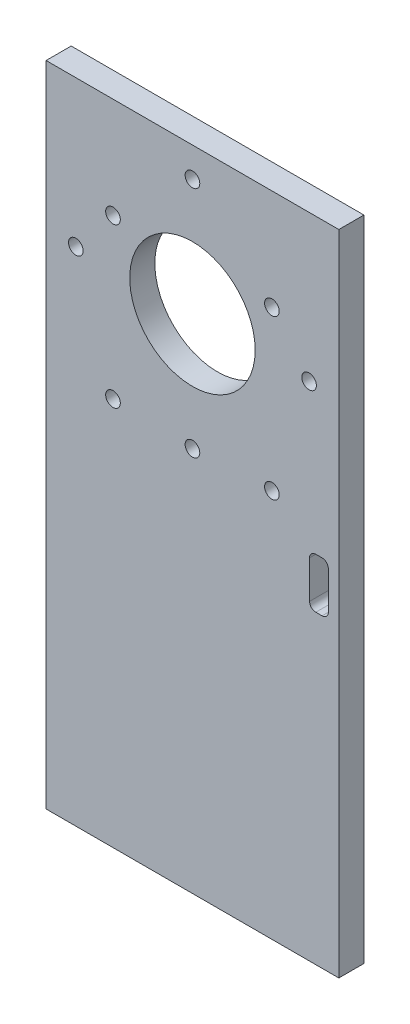
ISO-10303-21;
HEADER;
FILE_DESCRIPTION(('STEP AP214'),'2;1');
FILE_NAME('part.step','',(''),(''),'','','');
FILE_SCHEMA(('AUTOMOTIVE_DESIGN { 1 0 10303 214 1 1 1 1 }'));
ENDSEC;
DATA;
#1=APPLICATION_CONTEXT('core data for automotive mechanical design processes');
#2=APPLICATION_PROTOCOL_DEFINITION('international standard','automotive_design',2000,#1);
#3=PRODUCT_CONTEXT('',#1,'mechanical');
#4=PRODUCT('Part','Part','',(#3));
#5=PRODUCT_RELATED_PRODUCT_CATEGORY('part','',(#4));
#6=PRODUCT_DEFINITION_FORMATION('','',#4);
#7=PRODUCT_DEFINITION_CONTEXT('part definition',#1,'design');
#8=PRODUCT_DEFINITION('design','',#6,#7);
#9=PRODUCT_DEFINITION_SHAPE('','',#8);
#10=(LENGTH_UNIT() NAMED_UNIT(*) SI_UNIT(.MILLI.,.METRE.));
#11=(NAMED_UNIT(*) PLANE_ANGLE_UNIT() SI_UNIT($,.RADIAN.));
#12=(NAMED_UNIT(*) SI_UNIT($,.STERADIAN.) SOLID_ANGLE_UNIT());
#13=UNCERTAINTY_MEASURE_WITH_UNIT(LENGTH_MEASURE(1.E-05),#10,'distance_accuracy_value','');
#14=(GEOMETRIC_REPRESENTATION_CONTEXT(3) GLOBAL_UNCERTAINTY_ASSIGNED_CONTEXT((#13)) GLOBAL_UNIT_ASSIGNED_CONTEXT((#10,
#11,#12)) REPRESENTATION_CONTEXT('',''));
#15=CARTESIAN_POINT('',(0.,0.,0.));
#16=DIRECTION('',(0.,0.,1.));
#17=DIRECTION('',(1.,0.,0.));
#18=AXIS2_PLACEMENT_3D('',#15,#16,#17);
#19=CARTESIAN_POINT('',(35.,77.5,6.));
#20=DIRECTION('',(-1.,0.,0.));
#21=DIRECTION('',(0.,-1.,0.));
#22=AXIS2_PLACEMENT_3D('',#19,#20,#21);
#23=PLANE('',#22);
#24=DIRECTION('',(0.,1.,0.));
#25=VECTOR('',#24,1.);
#26=CARTESIAN_POINT('',(35.,77.5,0.));
#27=LINE('',#26,#25);
#28=CARTESIAN_POINT('',(35.,-77.5,0.));
#29=VERTEX_POINT('',#28);
#30=CARTESIAN_POINT('',(35.,77.5,0.));
#31=VERTEX_POINT('',#30);
#32=EDGE_CURVE('E221',#29,#31,#27,.T.);
#33=ORIENTED_EDGE('',*,*,#32,.T.);
#34=DIRECTION('',(0.,0.,-1.));
#35=VECTOR('',#34,1.);
#36=CARTESIAN_POINT('',(35.,77.5,6.));
#37=LINE('',#36,#35);
#38=CARTESIAN_POINT('',(35.,77.5,6.));
#39=VERTEX_POINT('',#38);
#40=EDGE_CURVE('E11',#39,#31,#37,.T.);
#41=ORIENTED_EDGE('',*,*,#40,.F.);
#42=DIRECTION('',(0.,1.,0.));
#43=VECTOR('',#42,1.);
#44=CARTESIAN_POINT('',(35.,77.5,6.));
#45=LINE('',#44,#43);
#46=CARTESIAN_POINT('',(35.,-77.5,6.));
#47=VERTEX_POINT('',#46);
#48=EDGE_CURVE('E224',#47,#39,#45,.T.);
#49=ORIENTED_EDGE('',*,*,#48,.F.);
#50=DIRECTION('',(0.,0.,-1.));
#51=VECTOR('',#50,1.);
#52=CARTESIAN_POINT('',(35.,-77.5,6.));
#53=LINE('',#52,#51);
#54=EDGE_CURVE('E234',#47,#29,#53,.T.);
#55=ORIENTED_EDGE('',*,*,#54,.T.);
#56=EDGE_LOOP('',(#33,#41,#49,#55));
#57=FACE_BOUND('',#56,.T.);
#58=ADVANCED_FACE('F33',(#57),#23,.F.);
#59=CARTESIAN_POINT('',(-35.,77.5,6.));
#60=DIRECTION('',(0.,-1.,0.));
#61=DIRECTION('',(0.,0.,-1.));
#62=AXIS2_PLACEMENT_3D('',#59,#60,#61);
#63=PLANE('',#62);
#64=DIRECTION('',(-1.,0.,0.));
#65=VECTOR('',#64,1.);
#66=CARTESIAN_POINT('',(-35.,77.5,0.));
#67=LINE('',#66,#65);
#68=CARTESIAN_POINT('',(-35.,77.5,0.));
#69=VERTEX_POINT('',#68);
#70=EDGE_CURVE('E237',#31,#69,#67,.T.);
#71=ORIENTED_EDGE('',*,*,#70,.T.);
#72=DIRECTION('',(0.,0.,-1.));
#73=VECTOR('',#72,1.);
#74=CARTESIAN_POINT('',(-35.,77.5,6.));
#75=LINE('',#74,#73);
#76=CARTESIAN_POINT('',(-35.,77.5,6.));
#77=VERTEX_POINT('',#76);
#78=EDGE_CURVE('E40',#77,#69,#75,.T.);
#79=ORIENTED_EDGE('',*,*,#78,.F.);
#80=DIRECTION('',(-1.,0.,0.));
#81=VECTOR('',#80,1.);
#82=CARTESIAN_POINT('',(-35.,77.5,6.));
#83=LINE('',#82,#81);
#84=EDGE_CURVE('E227',#39,#77,#83,.T.);
#85=ORIENTED_EDGE('',*,*,#84,.F.);
#86=ORIENTED_EDGE('',*,*,#40,.T.);
#87=EDGE_LOOP('',(#71,#79,#85,#86));
#88=FACE_BOUND('',#87,.T.);
#89=ADVANCED_FACE('F266',(#88),#63,.F.);
#90=CARTESIAN_POINT('',(-35.,77.5,6.));
#91=DIRECTION('',(1.,0.,0.));
#92=DIRECTION('',(0.,1.,0.));
#93=AXIS2_PLACEMENT_3D('',#90,#91,#92);
#94=PLANE('',#93);
#95=DIRECTION('',(0.,-1.,0.));
#96=VECTOR('',#95,1.);
#97=CARTESIAN_POINT('',(-35.,77.5,0.));
#98=LINE('',#97,#96);
#99=CARTESIAN_POINT('',(-35.,-77.5,0.));
#100=VERTEX_POINT('',#99);
#101=EDGE_CURVE('E239',#69,#100,#98,.T.);
#102=ORIENTED_EDGE('',*,*,#101,.T.);
#103=DIRECTION('',(0.,0.,-1.));
#104=VECTOR('',#103,1.);
#105=CARTESIAN_POINT('',(-35.,-77.5,6.));
#106=LINE('',#105,#104);
#107=CARTESIAN_POINT('',(-35.,-77.5,6.));
#108=VERTEX_POINT('',#107);
#109=EDGE_CURVE('E244',#108,#100,#106,.T.);
#110=ORIENTED_EDGE('',*,*,#109,.F.);
#111=DIRECTION('',(0.,-1.,0.));
#112=VECTOR('',#111,1.);
#113=CARTESIAN_POINT('',(-35.,77.5,6.));
#114=LINE('',#113,#112);
#115=EDGE_CURVE('E230',#77,#108,#114,.T.);
#116=ORIENTED_EDGE('',*,*,#115,.F.);
#117=ORIENTED_EDGE('',*,*,#78,.T.);
#118=EDGE_LOOP('',(#102,#110,#116,#117));
#119=FACE_BOUND('',#118,.T.);
#120=ADVANCED_FACE('F251',(#119),#94,.F.);
#121=CARTESIAN_POINT('',(-35.,-77.5,6.));
#122=DIRECTION('',(0.,1.,0.));
#123=DIRECTION('',(0.,0.,1.));
#124=AXIS2_PLACEMENT_3D('',#121,#122,#123);
#125=PLANE('',#124);
#126=DIRECTION('',(1.,0.,0.));
#127=VECTOR('',#126,1.);
#128=CARTESIAN_POINT('',(-35.,-77.5,0.));
#129=LINE('',#128,#127);
#130=EDGE_CURVE('E228',#100,#29,#129,.T.);
#131=ORIENTED_EDGE('',*,*,#130,.T.);
#132=ORIENTED_EDGE('',*,*,#54,.F.);
#133=DIRECTION('',(1.,0.,0.));
#134=VECTOR('',#133,1.);
#135=CARTESIAN_POINT('',(-35.,-77.5,6.));
#136=LINE('',#135,#134);
#137=EDGE_CURVE('E232',#108,#47,#136,.T.);
#138=ORIENTED_EDGE('',*,*,#137,.F.);
#139=ORIENTED_EDGE('',*,*,#109,.T.);
#140=EDGE_LOOP('',(#131,#132,#138,#139));
#141=FACE_BOUND('',#140,.T.);
#142=ADVANCED_FACE('F259',(#141),#125,.F.);
#143=CARTESIAN_POINT('',(0.,0.,6.));
#144=DIRECTION('',(0.,0.,1.));
#145=DIRECTION('',(1.,0.,0.));
#146=AXIS2_PLACEMENT_3D('',#143,#144,#145);
#147=PLANE('',#146);
#148=CARTESIAN_POINT('',(0.,70.388022687531,6.));
#149=DIRECTION('',(0.,0.,1.));
#150=DIRECTION('',(1.,0.,0.));
#151=AXIS2_PLACEMENT_3D('',#148,#149,#150);
#152=CIRCLE('',#151,1.75);
#153=CARTESIAN_POINT('',(1.75,70.388022687531,6.));
#154=VERTEX_POINT('',#153);
#155=EDGE_CURVE('E352',#154,#154,#152,.T.);
#156=ORIENTED_EDGE('',*,*,#155,.F.);
#157=EDGE_LOOP('',(#156));
#158=FACE_BOUND('',#157,.T.);
#159=CARTESIAN_POINT('',(27.888022687531,42.5000000000001,6.));
#160=DIRECTION('',(0.,0.,1.));
#161=DIRECTION('',(1.,0.,0.));
#162=AXIS2_PLACEMENT_3D('',#159,#160,#161);
#163=CIRCLE('',#162,1.75);
#164=CARTESIAN_POINT('',(29.638022687531,42.5000000000001,6.));
#165=VERTEX_POINT('',#164);
#166=EDGE_CURVE('E354',#165,#165,#163,.T.);
#167=ORIENTED_EDGE('',*,*,#166,.F.);
#168=EDGE_LOOP('',(#167));
#169=FACE_BOUND('',#168,.T.);
#170=CARTESIAN_POINT('',(0.,14.611977312469,6.));
#171=DIRECTION('',(0.,0.,1.));
#172=DIRECTION('',(1.,0.,0.));
#173=AXIS2_PLACEMENT_3D('',#170,#171,#172);
#174=CIRCLE('',#173,1.75);
#175=CARTESIAN_POINT('',(1.75,14.611977312469,6.));
#176=VERTEX_POINT('',#175);
#177=EDGE_CURVE('E360',#176,#176,#174,.T.);
#178=ORIENTED_EDGE('',*,*,#177,.F.);
#179=EDGE_LOOP('',(#178));
#180=FACE_BOUND('',#179,.T.);
#181=CARTESIAN_POINT('',(-27.888022687531,42.4999999999997,6.));
#182=DIRECTION('',(0.,0.,1.));
#183=DIRECTION('',(1.,0.,0.));
#184=AXIS2_PLACEMENT_3D('',#181,#182,#183);
#185=CIRCLE('',#184,1.75);
#186=CARTESIAN_POINT('',(-26.138022687531,42.4999999999997,6.));
#187=VERTEX_POINT('',#186);
#188=EDGE_CURVE('E146',#187,#187,#185,.T.);
#189=ORIENTED_EDGE('',*,*,#188,.F.);
#190=EDGE_LOOP('',(#189));
#191=FACE_BOUND('',#190,.T.);
#192=CARTESIAN_POINT('',(29.5,6.00000000000001,6.));
#193=DIRECTION('',(0.,0.,1.));
#194=DIRECTION('',(1.,0.,0.));
#195=AXIS2_PLACEMENT_3D('',#192,#193,#194);
#196=CIRCLE('',#195,1.5);
#197=CARTESIAN_POINT('',(29.5,7.50000000000001,6.));
#198=VERTEX_POINT('',#197);
#199=CARTESIAN_POINT('',(28.,6.00000000000001,6.));
#200=VERTEX_POINT('',#199);
#201=EDGE_CURVE('E47',#198,#200,#196,.T.);
#202=ORIENTED_EDGE('',*,*,#201,.F.);
#203=DIRECTION('',(-1.,0.,0.));
#204=VECTOR('',#203,1.);
#205=CARTESIAN_POINT('',(29.5,7.50000000000001,6.));
#206=LINE('',#205,#204);
#207=CARTESIAN_POINT('',(31.,7.50000000000001,6.));
#208=VERTEX_POINT('',#207);
#209=EDGE_CURVE('E140',#208,#198,#206,.T.);
#210=ORIENTED_EDGE('',*,*,#209,.F.);
#211=CARTESIAN_POINT('',(31.,6.00000000000001,6.));
#212=DIRECTION('',(0.,0.,1.));
#213=DIRECTION('',(-1.,0.,0.));
#214=AXIS2_PLACEMENT_3D('',#211,#212,#213);
#215=CIRCLE('',#214,1.5);
#216=CARTESIAN_POINT('',(32.5,6.00000000000001,6.));
#217=VERTEX_POINT('',#216);
#218=EDGE_CURVE('E143',#217,#208,#215,.T.);
#219=ORIENTED_EDGE('',*,*,#218,.F.);
#220=DIRECTION('',(0.,1.,0.));
#221=VECTOR('',#220,1.);
#222=CARTESIAN_POINT('',(32.5,6.00000000000001,6.));
#223=LINE('',#222,#221);
#224=CARTESIAN_POINT('',(32.5,-3.,6.));
#225=VERTEX_POINT('',#224);
#226=EDGE_CURVE('E175',#225,#217,#223,.T.);
#227=ORIENTED_EDGE('',*,*,#226,.F.);
#228=CARTESIAN_POINT('',(31.,-2.99999999999999,6.));
#229=DIRECTION('',(0.,0.,1.));
#230=DIRECTION('',(-1.,0.,0.));
#231=AXIS2_PLACEMENT_3D('',#228,#229,#230);
#232=CIRCLE('',#231,1.5);
#233=CARTESIAN_POINT('',(31.,-4.49999999999999,6.));
#234=VERTEX_POINT('',#233);
#235=EDGE_CURVE('E172',#234,#225,#232,.T.);
#236=ORIENTED_EDGE('',*,*,#235,.F.);
#237=DIRECTION('',(1.,0.,0.));
#238=VECTOR('',#237,1.);
#239=CARTESIAN_POINT('',(31.,-4.5,6.));
#240=LINE('',#239,#238);
#241=CARTESIAN_POINT('',(29.5,-4.5,6.));
#242=VERTEX_POINT('',#241);
#243=EDGE_CURVE('E169',#242,#234,#240,.T.);
#244=ORIENTED_EDGE('',*,*,#243,.F.);
#245=CARTESIAN_POINT('',(29.5,-2.99999999999999,6.));
#246=DIRECTION('',(0.,0.,1.));
#247=DIRECTION('',(-1.,0.,0.));
#248=AXIS2_PLACEMENT_3D('',#245,#246,#247);
#249=CIRCLE('',#248,1.5);
#250=CARTESIAN_POINT('',(28.,-3.,6.));
#251=VERTEX_POINT('',#250);
#252=EDGE_CURVE('E166',#251,#242,#249,.T.);
#253=ORIENTED_EDGE('',*,*,#252,.F.);
#254=DIRECTION('',(0.,-1.,0.));
#255=VECTOR('',#254,1.);
#256=CARTESIAN_POINT('',(28.,-3.,6.));
#257=LINE('',#256,#255);
#258=EDGE_CURVE('E163',#200,#251,#257,.T.);
#259=ORIENTED_EDGE('',*,*,#258,.F.);
#260=EDGE_LOOP('',(#202,#210,#219,#227,#236,#244,#253,#259));
#261=FACE_BOUND('',#260,.T.);
#262=CARTESIAN_POINT('',(-19.,15.4,6.));
#263=DIRECTION('',(0.,0.,-1.));
#264=DIRECTION('',(-1.,0.,0.));
#265=AXIS2_PLACEMENT_3D('',#262,#263,#264);
#266=CIRCLE('',#265,1.75);
#267=CARTESIAN_POINT('',(-20.75,15.4,6.));
#268=VERTEX_POINT('',#267);
#269=EDGE_CURVE('E194',#268,#268,#266,.T.);
#270=ORIENTED_EDGE('',*,*,#269,.T.);
#271=EDGE_LOOP('',(#270));
#272=FACE_BOUND('',#271,.T.);
#273=CARTESIAN_POINT('',(19.,15.4,6.));
#274=DIRECTION('',(0.,0.,-1.));
#275=DIRECTION('',(-1.,0.,0.));
#276=AXIS2_PLACEMENT_3D('',#273,#274,#275);
#277=CIRCLE('',#276,1.75);
#278=CARTESIAN_POINT('',(17.25,15.4,6.));
#279=VERTEX_POINT('',#278);
#280=EDGE_CURVE('E200',#279,#279,#277,.T.);
#281=ORIENTED_EDGE('',*,*,#280,.T.);
#282=EDGE_LOOP('',(#281));
#283=FACE_BOUND('',#282,.T.);
#284=CARTESIAN_POINT('',(-19.,53.4,6.));
#285=DIRECTION('',(0.,0.,-1.));
#286=DIRECTION('',(-1.,0.,0.));
#287=AXIS2_PLACEMENT_3D('',#284,#285,#286);
#288=CIRCLE('',#287,1.75);
#289=CARTESIAN_POINT('',(-20.75,53.4,6.));
#290=VERTEX_POINT('',#289);
#291=EDGE_CURVE('E206',#290,#290,#288,.T.);
#292=ORIENTED_EDGE('',*,*,#291,.T.);
#293=EDGE_LOOP('',(#292));
#294=FACE_BOUND('',#293,.T.);
#295=CARTESIAN_POINT('',(19.,53.4,6.));
#296=DIRECTION('',(0.,0.,-1.));
#297=DIRECTION('',(-1.,0.,0.));
#298=AXIS2_PLACEMENT_3D('',#295,#296,#297);
#299=CIRCLE('',#298,1.75);
#300=CARTESIAN_POINT('',(17.25,53.4,6.));
#301=VERTEX_POINT('',#300);
#302=EDGE_CURVE('E212',#301,#301,#299,.T.);
#303=ORIENTED_EDGE('',*,*,#302,.T.);
#304=EDGE_LOOP('',(#303));
#305=FACE_BOUND('',#304,.T.);
#306=CARTESIAN_POINT('',(0.,42.5,6.));
#307=DIRECTION('',(0.,0.,1.));
#308=DIRECTION('',(1.,0.,0.));
#309=AXIS2_PLACEMENT_3D('',#306,#307,#308);
#310=CIRCLE('',#309,15.);
#311=CARTESIAN_POINT('',(15.,42.5,6.));
#312=VERTEX_POINT('',#311);
#313=EDGE_CURVE('E215',#312,#312,#310,.T.);
#314=ORIENTED_EDGE('',*,*,#313,.F.);
#315=EDGE_LOOP('',(#314));
#316=FACE_BOUND('',#315,.T.);
#317=ORIENTED_EDGE('',*,*,#48,.T.);
#318=ORIENTED_EDGE('',*,*,#84,.T.);
#319=ORIENTED_EDGE('',*,*,#115,.T.);
#320=ORIENTED_EDGE('',*,*,#137,.T.);
#321=EDGE_LOOP('',(#317,#318,#319,#320));
#322=FACE_BOUND('',#321,.T.);
#323=ADVANCED_FACE('F265',(#158,#169,#180,#191,#261,#272,#283,#294,#305,#316,#322),#147,.T.);
#324=CARTESIAN_POINT('',(0.,0.,0.));
#325=DIRECTION('',(0.,0.,1.));
#326=DIRECTION('',(1.,0.,0.));
#327=AXIS2_PLACEMENT_3D('',#324,#325,#326);
#328=PLANE('',#327);
#329=CARTESIAN_POINT('',(0.,70.388022687531,0.));
#330=DIRECTION('',(0.,0.,1.));
#331=DIRECTION('',(1.,0.,0.));
#332=AXIS2_PLACEMENT_3D('',#329,#330,#331);
#333=CIRCLE('',#332,1.75);
#334=CARTESIAN_POINT('',(1.75,70.388022687531,0.));
#335=VERTEX_POINT('',#334);
#336=EDGE_CURVE('E349',#335,#335,#333,.T.);
#337=ORIENTED_EDGE('',*,*,#336,.T.);
#338=EDGE_LOOP('',(#337));
#339=FACE_BOUND('',#338,.T.);
#340=CARTESIAN_POINT('',(27.888022687531,42.5000000000001,0.));
#341=DIRECTION('',(0.,0.,1.));
#342=DIRECTION('',(1.,0.,0.));
#343=AXIS2_PLACEMENT_3D('',#340,#341,#342);
#344=CIRCLE('',#343,1.75);
#345=CARTESIAN_POINT('',(29.638022687531,42.5000000000001,0.));
#346=VERTEX_POINT('',#345);
#347=EDGE_CURVE('E357',#346,#346,#344,.T.);
#348=ORIENTED_EDGE('',*,*,#347,.T.);
#349=EDGE_LOOP('',(#348));
#350=FACE_BOUND('',#349,.T.);
#351=CARTESIAN_POINT('',(0.,14.611977312469,0.));
#352=DIRECTION('',(0.,0.,1.));
#353=DIRECTION('',(1.,0.,0.));
#354=AXIS2_PLACEMENT_3D('',#351,#352,#353);
#355=CIRCLE('',#354,1.75);
#356=CARTESIAN_POINT('',(1.75,14.611977312469,0.));
#357=VERTEX_POINT('',#356);
#358=EDGE_CURVE('E363',#357,#357,#355,.T.);
#359=ORIENTED_EDGE('',*,*,#358,.T.);
#360=EDGE_LOOP('',(#359));
#361=FACE_BOUND('',#360,.T.);
#362=CARTESIAN_POINT('',(-27.888022687531,42.4999999999997,0.));
#363=DIRECTION('',(0.,0.,1.));
#364=DIRECTION('',(1.,0.,0.));
#365=AXIS2_PLACEMENT_3D('',#362,#363,#364);
#366=CIRCLE('',#365,1.75);
#367=CARTESIAN_POINT('',(-26.138022687531,42.4999999999997,0.));
#368=VERTEX_POINT('',#367);
#369=EDGE_CURVE('E164',#368,#368,#366,.T.);
#370=ORIENTED_EDGE('',*,*,#369,.T.);
#371=EDGE_LOOP('',(#370));
#372=FACE_BOUND('',#371,.T.);
#373=DIRECTION('',(-1.,0.,0.));
#374=VECTOR('',#373,1.);
#375=CARTESIAN_POINT('',(29.5,7.50000000000001,0.));
#376=LINE('',#375,#374);
#377=CARTESIAN_POINT('',(31.,7.50000000000001,0.));
#378=VERTEX_POINT('',#377);
#379=CARTESIAN_POINT('',(29.5,7.50000000000001,0.));
#380=VERTEX_POINT('',#379);
#381=EDGE_CURVE('E129',#378,#380,#376,.T.);
#382=ORIENTED_EDGE('',*,*,#381,.T.);
#383=CARTESIAN_POINT('',(29.5,6.00000000000001,0.));
#384=DIRECTION('',(0.,0.,1.));
#385=DIRECTION('',(1.,0.,0.));
#386=AXIS2_PLACEMENT_3D('',#383,#384,#385);
#387=CIRCLE('',#386,1.5);
#388=CARTESIAN_POINT('',(28.,6.00000000000001,0.));
#389=VERTEX_POINT('',#388);
#390=EDGE_CURVE('E123',#380,#389,#387,.T.);
#391=ORIENTED_EDGE('',*,*,#390,.T.);
#392=DIRECTION('',(0.,-1.,0.));
#393=VECTOR('',#392,1.);
#394=CARTESIAN_POINT('',(28.,-3.,0.));
#395=LINE('',#394,#393);
#396=CARTESIAN_POINT('',(28.,-3.,0.));
#397=VERTEX_POINT('',#396);
#398=EDGE_CURVE('E132',#389,#397,#395,.T.);
#399=ORIENTED_EDGE('',*,*,#398,.T.);
#400=CARTESIAN_POINT('',(29.5,-2.99999999999999,0.));
#401=DIRECTION('',(0.,0.,1.));
#402=DIRECTION('',(-1.,0.,0.));
#403=AXIS2_PLACEMENT_3D('',#400,#401,#402);
#404=CIRCLE('',#403,1.5);
#405=CARTESIAN_POINT('',(29.5,-4.5,0.));
#406=VERTEX_POINT('',#405);
#407=EDGE_CURVE('E55',#397,#406,#404,.T.);
#408=ORIENTED_EDGE('',*,*,#407,.T.);
#409=DIRECTION('',(1.,0.,0.));
#410=VECTOR('',#409,1.);
#411=CARTESIAN_POINT('',(31.,-4.5,0.));
#412=LINE('',#411,#410);
#413=CARTESIAN_POINT('',(31.,-4.49999999999999,0.));
#414=VERTEX_POINT('',#413);
#415=EDGE_CURVE('E150',#406,#414,#412,.T.);
#416=ORIENTED_EDGE('',*,*,#415,.T.);
#417=CARTESIAN_POINT('',(31.,-2.99999999999999,0.));
#418=DIRECTION('',(0.,0.,1.));
#419=DIRECTION('',(-1.,0.,0.));
#420=AXIS2_PLACEMENT_3D('',#417,#418,#419);
#421=CIRCLE('',#420,1.5);
#422=CARTESIAN_POINT('',(32.5,-3.,0.));
#423=VERTEX_POINT('',#422);
#424=EDGE_CURVE('E153',#414,#423,#421,.T.);
#425=ORIENTED_EDGE('',*,*,#424,.T.);
#426=DIRECTION('',(0.,1.,0.));
#427=VECTOR('',#426,1.);
#428=CARTESIAN_POINT('',(32.5,6.00000000000001,0.));
#429=LINE('',#428,#427);
#430=CARTESIAN_POINT('',(32.5,6.00000000000001,0.));
#431=VERTEX_POINT('',#430);
#432=EDGE_CURVE('E156',#423,#431,#429,.T.);
#433=ORIENTED_EDGE('',*,*,#432,.T.);
#434=CARTESIAN_POINT('',(31.,6.00000000000001,0.));
#435=DIRECTION('',(0.,0.,1.));
#436=DIRECTION('',(-1.,0.,0.));
#437=AXIS2_PLACEMENT_3D('',#434,#435,#436);
#438=CIRCLE('',#437,1.5);
#439=EDGE_CURVE('E159',#431,#378,#438,.T.);
#440=ORIENTED_EDGE('',*,*,#439,.T.);
#441=EDGE_LOOP('',(#382,#391,#399,#408,#416,#425,#433,#440));
#442=FACE_BOUND('',#441,.T.);
#443=CARTESIAN_POINT('',(-19.,15.4,0.));
#444=DIRECTION('',(0.,0.,-1.));
#445=DIRECTION('',(-1.,0.,0.));
#446=AXIS2_PLACEMENT_3D('',#443,#444,#445);
#447=CIRCLE('',#446,1.75);
#448=CARTESIAN_POINT('',(-20.75,15.4,0.));
#449=VERTEX_POINT('',#448);
#450=EDGE_CURVE('E182',#449,#449,#447,.T.);
#451=ORIENTED_EDGE('',*,*,#450,.F.);
#452=EDGE_LOOP('',(#451));
#453=FACE_BOUND('',#452,.T.);
#454=CARTESIAN_POINT('',(19.,15.4,0.));
#455=DIRECTION('',(0.,0.,-1.));
#456=DIRECTION('',(-1.,0.,0.));
#457=AXIS2_PLACEMENT_3D('',#454,#455,#456);
#458=CIRCLE('',#457,1.75);
#459=CARTESIAN_POINT('',(17.25,15.4,0.));
#460=VERTEX_POINT('',#459);
#461=EDGE_CURVE('E197',#460,#460,#458,.T.);
#462=ORIENTED_EDGE('',*,*,#461,.F.);
#463=EDGE_LOOP('',(#462));
#464=FACE_BOUND('',#463,.T.);
#465=CARTESIAN_POINT('',(-19.,53.4,0.));
#466=DIRECTION('',(0.,0.,-1.));
#467=DIRECTION('',(-1.,0.,0.));
#468=AXIS2_PLACEMENT_3D('',#465,#466,#467);
#469=CIRCLE('',#468,1.75);
#470=CARTESIAN_POINT('',(-20.75,53.4,0.));
#471=VERTEX_POINT('',#470);
#472=EDGE_CURVE('E203',#471,#471,#469,.T.);
#473=ORIENTED_EDGE('',*,*,#472,.F.);
#474=EDGE_LOOP('',(#473));
#475=FACE_BOUND('',#474,.T.);
#476=CARTESIAN_POINT('',(19.,53.4,0.));
#477=DIRECTION('',(0.,0.,-1.));
#478=DIRECTION('',(-1.,0.,0.));
#479=AXIS2_PLACEMENT_3D('',#476,#477,#478);
#480=CIRCLE('',#479,1.75);
#481=CARTESIAN_POINT('',(17.25,53.4,0.));
#482=VERTEX_POINT('',#481);
#483=EDGE_CURVE('E209',#482,#482,#480,.T.);
#484=ORIENTED_EDGE('',*,*,#483,.F.);
#485=EDGE_LOOP('',(#484));
#486=FACE_BOUND('',#485,.T.);
#487=CARTESIAN_POINT('',(0.,42.5,0.));
#488=DIRECTION('',(0.,0.,1.));
#489=DIRECTION('',(1.,0.,0.));
#490=AXIS2_PLACEMENT_3D('',#487,#488,#489);
#491=CIRCLE('',#490,15.);
#492=CARTESIAN_POINT('',(15.,42.5,0.));
#493=VERTEX_POINT('',#492);
#494=EDGE_CURVE('E218',#493,#493,#491,.T.);
#495=ORIENTED_EDGE('',*,*,#494,.T.);
#496=EDGE_LOOP('',(#495));
#497=FACE_BOUND('',#496,.T.);
#498=ORIENTED_EDGE('',*,*,#32,.F.);
#499=ORIENTED_EDGE('',*,*,#130,.F.);
#500=ORIENTED_EDGE('',*,*,#101,.F.);
#501=ORIENTED_EDGE('',*,*,#70,.F.);
#502=EDGE_LOOP('',(#498,#499,#500,#501));
#503=FACE_BOUND('',#502,.T.);
#504=ADVANCED_FACE('F136',(#339,#350,#361,#372,#442,#453,#464,#475,#486,#497,#503),#328,.F.);
#505=CARTESIAN_POINT('',(0.,42.5,0.));
#506=DIRECTION('',(0.,0.,1.));
#507=DIRECTION('',(1.,0.,0.));
#508=AXIS2_PLACEMENT_3D('',#505,#506,#507);
#509=CYLINDRICAL_SURFACE('',#508,15.);
#510=ORIENTED_EDGE('',*,*,#494,.F.);
#511=EDGE_LOOP('',(#510));
#512=FACE_BOUND('',#511,.T.);
#513=ORIENTED_EDGE('',*,*,#313,.T.);
#514=EDGE_LOOP('',(#513));
#515=FACE_BOUND('',#514,.T.);
#516=ADVANCED_FACE('F278',(#512,#515),#509,.F.);
#517=CARTESIAN_POINT('',(19.,53.4,6.));
#518=DIRECTION('',(0.,0.,-1.));
#519=DIRECTION('',(-1.,0.,0.));
#520=AXIS2_PLACEMENT_3D('',#517,#518,#519);
#521=CYLINDRICAL_SURFACE('',#520,1.75);
#522=ORIENTED_EDGE('',*,*,#302,.F.);
#523=EDGE_LOOP('',(#522));
#524=FACE_BOUND('',#523,.T.);
#525=ORIENTED_EDGE('',*,*,#483,.T.);
#526=EDGE_LOOP('',(#525));
#527=FACE_BOUND('',#526,.T.);
#528=ADVANCED_FACE('F285',(#524,#527),#521,.F.);
#529=CARTESIAN_POINT('',(-19.,53.4,6.));
#530=DIRECTION('',(0.,0.,-1.));
#531=DIRECTION('',(-1.,0.,0.));
#532=AXIS2_PLACEMENT_3D('',#529,#530,#531);
#533=CYLINDRICAL_SURFACE('',#532,1.75);
#534=ORIENTED_EDGE('',*,*,#291,.F.);
#535=EDGE_LOOP('',(#534));
#536=FACE_BOUND('',#535,.T.);
#537=ORIENTED_EDGE('',*,*,#472,.T.);
#538=EDGE_LOOP('',(#537));
#539=FACE_BOUND('',#538,.T.);
#540=ADVANCED_FACE('F289',(#536,#539),#533,.F.);
#541=CARTESIAN_POINT('',(19.,15.4,6.));
#542=DIRECTION('',(0.,0.,-1.));
#543=DIRECTION('',(-1.,0.,0.));
#544=AXIS2_PLACEMENT_3D('',#541,#542,#543);
#545=CYLINDRICAL_SURFACE('',#544,1.75);
#546=ORIENTED_EDGE('',*,*,#280,.F.);
#547=EDGE_LOOP('',(#546));
#548=FACE_BOUND('',#547,.T.);
#549=ORIENTED_EDGE('',*,*,#461,.T.);
#550=EDGE_LOOP('',(#549));
#551=FACE_BOUND('',#550,.T.);
#552=ADVANCED_FACE('F293',(#548,#551),#545,.F.);
#553=CARTESIAN_POINT('',(-19.,15.4,6.));
#554=DIRECTION('',(0.,0.,-1.));
#555=DIRECTION('',(-1.,0.,0.));
#556=AXIS2_PLACEMENT_3D('',#553,#554,#555);
#557=CYLINDRICAL_SURFACE('',#556,1.75);
#558=ORIENTED_EDGE('',*,*,#269,.F.);
#559=EDGE_LOOP('',(#558));
#560=FACE_BOUND('',#559,.T.);
#561=ORIENTED_EDGE('',*,*,#450,.T.);
#562=EDGE_LOOP('',(#561));
#563=FACE_BOUND('',#562,.T.);
#564=ADVANCED_FACE('F297',(#560,#563),#557,.F.);
#565=CARTESIAN_POINT('',(29.5,6.00000000000001,0.));
#566=DIRECTION('',(0.,0.,1.));
#567=DIRECTION('',(1.,0.,0.));
#568=AXIS2_PLACEMENT_3D('',#565,#566,#567);
#569=CYLINDRICAL_SURFACE('',#568,1.5);
#570=ORIENTED_EDGE('',*,*,#201,.T.);
#571=DIRECTION('',(0.,0.,1.));
#572=VECTOR('',#571,1.);
#573=CARTESIAN_POINT('',(28.,6.00000000000001,0.));
#574=LINE('',#573,#572);
#575=EDGE_CURVE('E119',#389,#200,#574,.T.);
#576=ORIENTED_EDGE('',*,*,#575,.F.);
#577=ORIENTED_EDGE('',*,*,#390,.F.);
#578=DIRECTION('',(0.,0.,1.));
#579=VECTOR('',#578,1.);
#580=CARTESIAN_POINT('',(29.5,7.50000000000001,0.));
#581=LINE('',#580,#579);
#582=EDGE_CURVE('E180',#380,#198,#581,.T.);
#583=ORIENTED_EDGE('',*,*,#582,.T.);
#584=EDGE_LOOP('',(#570,#576,#577,#583));
#585=FACE_BOUND('',#584,.T.);
#586=ADVANCED_FACE('F121',(#585),#569,.F.);
#587=CARTESIAN_POINT('',(29.5,7.50000000000001,0.));
#588=DIRECTION('',(0.,1.,0.));
#589=DIRECTION('',(0.,0.,1.));
#590=AXIS2_PLACEMENT_3D('',#587,#588,#589);
#591=PLANE('',#590);
#592=ORIENTED_EDGE('',*,*,#209,.T.);
#593=ORIENTED_EDGE('',*,*,#582,.F.);
#594=ORIENTED_EDGE('',*,*,#381,.F.);
#595=DIRECTION('',(0.,0.,1.));
#596=VECTOR('',#595,1.);
#597=CARTESIAN_POINT('',(31.,7.50000000000001,0.));
#598=LINE('',#597,#596);
#599=EDGE_CURVE('E183',#378,#208,#598,.T.);
#600=ORIENTED_EDGE('',*,*,#599,.T.);
#601=EDGE_LOOP('',(#592,#593,#594,#600));
#602=FACE_BOUND('',#601,.T.);
#603=ADVANCED_FACE('F304',(#602),#591,.F.);
#604=CARTESIAN_POINT('',(31.,6.00000000000001,0.));
#605=DIRECTION('',(0.,0.,1.));
#606=DIRECTION('',(1.,0.,0.));
#607=AXIS2_PLACEMENT_3D('',#604,#605,#606);
#608=CYLINDRICAL_SURFACE('',#607,1.5);
#609=ORIENTED_EDGE('',*,*,#218,.T.);
#610=ORIENTED_EDGE('',*,*,#599,.F.);
#611=ORIENTED_EDGE('',*,*,#439,.F.);
#612=DIRECTION('',(0.,0.,1.));
#613=VECTOR('',#612,1.);
#614=CARTESIAN_POINT('',(32.5,6.00000000000001,0.));
#615=LINE('',#614,#613);
#616=EDGE_CURVE('E185',#431,#217,#615,.T.);
#617=ORIENTED_EDGE('',*,*,#616,.T.);
#618=EDGE_LOOP('',(#609,#610,#611,#617));
#619=FACE_BOUND('',#618,.T.);
#620=ADVANCED_FACE('F322',(#619),#608,.F.);
#621=CARTESIAN_POINT('',(32.5,6.00000000000001,0.));
#622=DIRECTION('',(1.,0.,0.));
#623=DIRECTION('',(0.,1.,0.));
#624=AXIS2_PLACEMENT_3D('',#621,#622,#623);
#625=PLANE('',#624);
#626=ORIENTED_EDGE('',*,*,#226,.T.);
#627=ORIENTED_EDGE('',*,*,#616,.F.);
#628=ORIENTED_EDGE('',*,*,#432,.F.);
#629=DIRECTION('',(0.,0.,1.));
#630=VECTOR('',#629,1.);
#631=CARTESIAN_POINT('',(32.5,-3.,0.));
#632=LINE('',#631,#630);
#633=EDGE_CURVE('E187',#423,#225,#632,.T.);
#634=ORIENTED_EDGE('',*,*,#633,.T.);
#635=EDGE_LOOP('',(#626,#627,#628,#634));
#636=FACE_BOUND('',#635,.T.);
#637=ADVANCED_FACE('F318',(#636),#625,.F.);
#638=CARTESIAN_POINT('',(31.,-2.99999999999999,0.));
#639=DIRECTION('',(0.,0.,1.));
#640=DIRECTION('',(1.,0.,0.));
#641=AXIS2_PLACEMENT_3D('',#638,#639,#640);
#642=CYLINDRICAL_SURFACE('',#641,1.5);
#643=ORIENTED_EDGE('',*,*,#235,.T.);
#644=ORIENTED_EDGE('',*,*,#633,.F.);
#645=ORIENTED_EDGE('',*,*,#424,.F.);
#646=DIRECTION('',(0.,0.,1.));
#647=VECTOR('',#646,1.);
#648=CARTESIAN_POINT('',(31.,-4.49999999999999,0.));
#649=LINE('',#648,#647);
#650=EDGE_CURVE('E189',#414,#234,#649,.T.);
#651=ORIENTED_EDGE('',*,*,#650,.T.);
#652=EDGE_LOOP('',(#643,#644,#645,#651));
#653=FACE_BOUND('',#652,.T.);
#654=ADVANCED_FACE('F314',(#653),#642,.F.);
#655=CARTESIAN_POINT('',(31.,-4.5,0.));
#656=DIRECTION('',(0.,-1.,0.));
#657=DIRECTION('',(0.,0.,-1.));
#658=AXIS2_PLACEMENT_3D('',#655,#656,#657);
#659=PLANE('',#658);
#660=ORIENTED_EDGE('',*,*,#243,.T.);
#661=ORIENTED_EDGE('',*,*,#650,.F.);
#662=ORIENTED_EDGE('',*,*,#415,.F.);
#663=DIRECTION('',(0.,0.,1.));
#664=VECTOR('',#663,1.);
#665=CARTESIAN_POINT('',(29.5,-4.5,0.));
#666=LINE('',#665,#664);
#667=EDGE_CURVE('E191',#406,#242,#666,.T.);
#668=ORIENTED_EDGE('',*,*,#667,.T.);
#669=EDGE_LOOP('',(#660,#661,#662,#668));
#670=FACE_BOUND('',#669,.T.);
#671=ADVANCED_FACE('F311',(#670),#659,.F.);
#672=CARTESIAN_POINT('',(29.5,-2.99999999999999,0.));
#673=DIRECTION('',(0.,0.,1.));
#674=DIRECTION('',(1.,0.,0.));
#675=AXIS2_PLACEMENT_3D('',#672,#673,#674);
#676=CYLINDRICAL_SURFACE('',#675,1.5);
#677=ORIENTED_EDGE('',*,*,#252,.T.);
#678=ORIENTED_EDGE('',*,*,#667,.F.);
#679=ORIENTED_EDGE('',*,*,#407,.F.);
#680=DIRECTION('',(0.,0.,1.));
#681=VECTOR('',#680,1.);
#682=CARTESIAN_POINT('',(28.,-3.,0.));
#683=LINE('',#682,#681);
#684=EDGE_CURVE('E128',#397,#251,#683,.T.);
#685=ORIENTED_EDGE('',*,*,#684,.T.);
#686=EDGE_LOOP('',(#677,#678,#679,#685));
#687=FACE_BOUND('',#686,.T.);
#688=ADVANCED_FACE('F308',(#687),#676,.F.);
#689=CARTESIAN_POINT('',(28.,-3.,0.));
#690=DIRECTION('',(-1.,0.,0.));
#691=DIRECTION('',(0.,-1.,0.));
#692=AXIS2_PLACEMENT_3D('',#689,#690,#691);
#693=PLANE('',#692);
#694=ORIENTED_EDGE('',*,*,#258,.T.);
#695=ORIENTED_EDGE('',*,*,#684,.F.);
#696=ORIENTED_EDGE('',*,*,#398,.F.);
#697=ORIENTED_EDGE('',*,*,#575,.T.);
#698=EDGE_LOOP('',(#694,#695,#696,#697));
#699=FACE_BOUND('',#698,.T.);
#700=ADVANCED_FACE('F133',(#699),#693,.F.);
#701=CARTESIAN_POINT('',(-27.888022687531,42.4999999999997,0.));
#702=DIRECTION('',(0.,0.,1.));
#703=DIRECTION('',(1.,0.,0.));
#704=AXIS2_PLACEMENT_3D('',#701,#702,#703);
#705=CYLINDRICAL_SURFACE('',#704,1.75);
#706=ORIENTED_EDGE('',*,*,#369,.F.);
#707=EDGE_LOOP('',(#706));
#708=FACE_BOUND('',#707,.T.);
#709=ORIENTED_EDGE('',*,*,#188,.T.);
#710=EDGE_LOOP('',(#709));
#711=FACE_BOUND('',#710,.T.);
#712=ADVANCED_FACE('F307',(#708,#711),#705,.F.);
#713=CARTESIAN_POINT('',(0.,14.611977312469,0.));
#714=DIRECTION('',(0.,0.,1.));
#715=DIRECTION('',(1.,0.,0.));
#716=AXIS2_PLACEMENT_3D('',#713,#714,#715);
#717=CYLINDRICAL_SURFACE('',#716,1.75);
#718=ORIENTED_EDGE('',*,*,#358,.F.);
#719=EDGE_LOOP('',(#718));
#720=FACE_BOUND('',#719,.T.);
#721=ORIENTED_EDGE('',*,*,#177,.T.);
#722=EDGE_LOOP('',(#721));
#723=FACE_BOUND('',#722,.T.);
#724=ADVANCED_FACE('F332',(#720,#723),#717,.F.);
#725=CARTESIAN_POINT('',(27.888022687531,42.5000000000001,0.));
#726=DIRECTION('',(0.,0.,1.));
#727=DIRECTION('',(1.,0.,0.));
#728=AXIS2_PLACEMENT_3D('',#725,#726,#727);
#729=CYLINDRICAL_SURFACE('',#728,1.75);
#730=ORIENTED_EDGE('',*,*,#347,.F.);
#731=EDGE_LOOP('',(#730));
#732=FACE_BOUND('',#731,.T.);
#733=ORIENTED_EDGE('',*,*,#166,.T.);
#734=EDGE_LOOP('',(#733));
#735=FACE_BOUND('',#734,.T.);
#736=ADVANCED_FACE('F336',(#732,#735),#729,.F.);
#737=CARTESIAN_POINT('',(0.,70.388022687531,0.));
#738=DIRECTION('',(0.,0.,1.));
#739=DIRECTION('',(1.,0.,0.));
#740=AXIS2_PLACEMENT_3D('',#737,#738,#739);
#741=CYLINDRICAL_SURFACE('',#740,1.75);
#742=ORIENTED_EDGE('',*,*,#336,.F.);
#743=EDGE_LOOP('',(#742));
#744=FACE_BOUND('',#743,.T.);
#745=ORIENTED_EDGE('',*,*,#155,.T.);
#746=EDGE_LOOP('',(#745));
#747=FACE_BOUND('',#746,.T.);
#748=ADVANCED_FACE('F340',(#744,#747),#741,.F.);
#749=CLOSED_SHELL('',(#58,#89,#120,#142,#323,#504,#516,#528,#540,#552,#564,#586,#603,#620,#637,
#654,#671,#688,#700,#712,#724,#736,#748));
#750=MANIFOLD_SOLID_BREP('B2',#749);
#751=ADVANCED_BREP_SHAPE_REPRESENTATION('',(#18,#750),#14);
#752=SHAPE_DEFINITION_REPRESENTATION(#9,#751);
ENDSEC;
END-ISO-10303-21;
